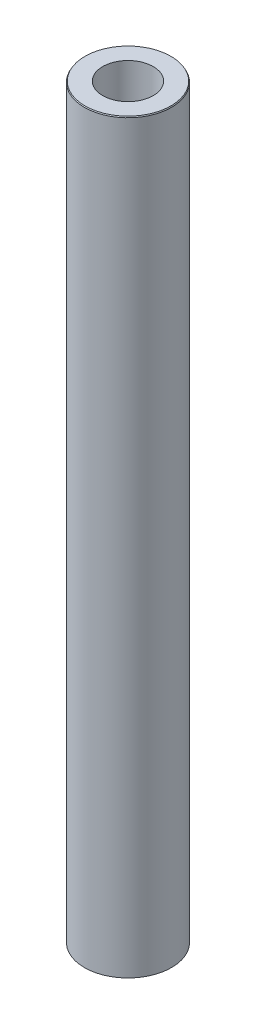
ISO-10303-21;
HEADER;
FILE_DESCRIPTION(('STEP AP214'),'2;1');
FILE_NAME('part.step','',(''),(''),'','','');
FILE_SCHEMA(('AUTOMOTIVE_DESIGN { 1 0 10303 214 1 1 1 1 }'));
ENDSEC;
DATA;
#1=APPLICATION_CONTEXT('core data for automotive mechanical design processes');
#2=APPLICATION_PROTOCOL_DEFINITION('international standard','automotive_design',2000,#1);
#3=PRODUCT_CONTEXT('',#1,'mechanical');
#4=PRODUCT('Part','Part','',(#3));
#5=PRODUCT_RELATED_PRODUCT_CATEGORY('part','',(#4));
#6=PRODUCT_DEFINITION_FORMATION('','',#4);
#7=PRODUCT_DEFINITION_CONTEXT('part definition',#1,'design');
#8=PRODUCT_DEFINITION('design','',#6,#7);
#9=PRODUCT_DEFINITION_SHAPE('','',#8);
#10=(LENGTH_UNIT() NAMED_UNIT(*) SI_UNIT(.MILLI.,.METRE.));
#11=(NAMED_UNIT(*) PLANE_ANGLE_UNIT() SI_UNIT($,.RADIAN.));
#12=(NAMED_UNIT(*) SI_UNIT($,.STERADIAN.) SOLID_ANGLE_UNIT());
#13=UNCERTAINTY_MEASURE_WITH_UNIT(LENGTH_MEASURE(1.E-05),#10,'distance_accuracy_value','');
#14=(GEOMETRIC_REPRESENTATION_CONTEXT(3) GLOBAL_UNCERTAINTY_ASSIGNED_CONTEXT((#13)) GLOBAL_UNIT_ASSIGNED_CONTEXT((#10,
#11,#12)) REPRESENTATION_CONTEXT('',''));
#15=CARTESIAN_POINT('',(0.,0.,0.));
#16=DIRECTION('',(0.,0.,1.));
#17=DIRECTION('',(1.,0.,0.));
#18=AXIS2_PLACEMENT_3D('',#15,#16,#17);
#19=CARTESIAN_POINT('',(0.,600.,0.));
#20=DIRECTION('',(0.,-1.,0.));
#21=DIRECTION('',(0.,0.,-1.));
#22=AXIS2_PLACEMENT_3D('',#19,#20,#21);
#23=CYLINDRICAL_SURFACE('',#22,35.);
#24=CARTESIAN_POINT('',(0.,599.197215256674,0.));
#25=DIRECTION('',(0.,1.,0.));
#26=DIRECTION('',(0.,0.,1.));
#27=AXIS2_PLACEMENT_3D('',#24,#25,#26);
#28=CIRCLE('',#27,35.);
#29=CARTESIAN_POINT('',(0.,599.197215256674,35.));
#30=VERTEX_POINT('',#29);
#31=EDGE_CURVE('E50',#30,#30,#28,.F.);
#32=ORIENTED_EDGE('',*,*,#31,.T.);
#33=EDGE_LOOP('',(#32));
#34=FACE_BOUND('',#33,.T.);
#35=CARTESIAN_POINT('',(0.,0.463487987660272,0.));
#36=DIRECTION('',(0.,1.,0.));
#37=DIRECTION('',(0.,0.,1.));
#38=AXIS2_PLACEMENT_3D('',#35,#36,#37);
#39=CIRCLE('',#38,35.);
#40=CARTESIAN_POINT('',(0.,0.463487987660272,35.));
#41=VERTEX_POINT('',#40);
#42=EDGE_CURVE('E51',#41,#41,#39,.T.);
#43=ORIENTED_EDGE('',*,*,#42,.T.);
#44=EDGE_LOOP('',(#43));
#45=FACE_BOUND('',#44,.T.);
#46=ADVANCED_FACE('F39',(#34,#45),#23,.T.);
#47=CARTESIAN_POINT('',(0.,600.,0.));
#48=DIRECTION('',(0.,1.,0.));
#49=DIRECTION('',(0.,0.,1.));
#50=AXIS2_PLACEMENT_3D('',#47,#48,#49);
#51=PLANE('',#50);
#52=CARTESIAN_POINT('',(0.,600.,0.));
#53=DIRECTION('',(0.,1.,0.));
#54=DIRECTION('',(0.,0.,1.));
#55=AXIS2_PLACEMENT_3D('',#52,#53,#54);
#56=CIRCLE('',#55,34.5365120123395);
#57=CARTESIAN_POINT('',(0.,600.,34.5365120123395));
#58=VERTEX_POINT('',#57);
#59=EDGE_CURVE('E54',#58,#58,#56,.T.);
#60=ORIENTED_EDGE('',*,*,#59,.T.);
#61=EDGE_LOOP('',(#60));
#62=FACE_BOUND('',#61,.T.);
#63=CARTESIAN_POINT('',(0.,600.,0.));
#64=DIRECTION('',(0.,1.,0.));
#65=DIRECTION('',(0.,0.,1.));
#66=AXIS2_PLACEMENT_3D('',#63,#64,#65);
#67=CIRCLE('',#66,20.2748592685679);
#68=CARTESIAN_POINT('',(0.,600.,20.2748592685679));
#69=VERTEX_POINT('',#68);
#70=EDGE_CURVE('E58',#69,#69,#67,.T.);
#71=ORIENTED_EDGE('',*,*,#70,.F.);
#72=EDGE_LOOP('',(#71));
#73=FACE_BOUND('',#72,.T.);
#74=ADVANCED_FACE('F69',(#62,#73),#51,.T.);
#75=CARTESIAN_POINT('',(0.,0.,0.));
#76=DIRECTION('',(0.,1.,0.));
#77=DIRECTION('',(0.,0.,1.));
#78=AXIS2_PLACEMENT_3D('',#75,#76,#77);
#79=PLANE('',#78);
#80=CARTESIAN_POINT('',(0.,0.,0.));
#81=DIRECTION('',(0.,1.,0.));
#82=DIRECTION('',(0.,0.,1.));
#83=AXIS2_PLACEMENT_3D('',#80,#81,#82);
#84=CIRCLE('',#83,34.1972152566745);
#85=CARTESIAN_POINT('',(0.,0.,34.1972152566745));
#86=VERTEX_POINT('',#85);
#87=EDGE_CURVE('E10',#86,#86,#84,.F.);
#88=ORIENTED_EDGE('',*,*,#87,.T.);
#89=EDGE_LOOP('',(#88));
#90=FACE_BOUND('',#89,.T.);
#91=CARTESIAN_POINT('',(0.,0.,0.));
#92=DIRECTION('',(0.,1.,0.));
#93=DIRECTION('',(0.,0.,1.));
#94=AXIS2_PLACEMENT_3D('',#91,#92,#93);
#95=CIRCLE('',#94,20.2748592685679);
#96=CARTESIAN_POINT('',(0.,0.,20.2748592685679));
#97=VERTEX_POINT('',#96);
#98=EDGE_CURVE('E63',#97,#97,#95,.T.);
#99=ORIENTED_EDGE('',*,*,#98,.T.);
#100=EDGE_LOOP('',(#99));
#101=FACE_BOUND('',#100,.T.);
#102=ADVANCED_FACE('F75',(#90,#101),#79,.F.);
#103=CARTESIAN_POINT('',(0.,600.,0.));
#104=DIRECTION('',(0.,-1.,0.));
#105=DIRECTION('',(0.,0.,-1.));
#106=AXIS2_PLACEMENT_3D('',#103,#104,#105);
#107=CYLINDRICAL_SURFACE('',#106,20.2748592685679);
#108=ORIENTED_EDGE('',*,*,#70,.T.);
#109=EDGE_LOOP('',(#108));
#110=FACE_BOUND('',#109,.T.);
#111=ORIENTED_EDGE('',*,*,#98,.F.);
#112=EDGE_LOOP('',(#111));
#113=FACE_BOUND('',#112,.T.);
#114=ADVANCED_FACE('F70',(#110,#113),#107,.F.);
#115=CARTESIAN_POINT('',(0.,600.,0.));
#116=DIRECTION('',(0.,-1.,0.));
#117=DIRECTION('',(0.,0.,-1.));
#118=AXIS2_PLACEMENT_3D('',#115,#116,#117);
#119=CONICAL_SURFACE('',#118,34.5365120123395,0.523598775598272);
#120=ORIENTED_EDGE('',*,*,#31,.F.);
#121=EDGE_LOOP('',(#120));
#122=FACE_BOUND('',#121,.T.);
#123=ORIENTED_EDGE('',*,*,#59,.F.);
#124=EDGE_LOOP('',(#123));
#125=FACE_BOUND('',#124,.T.);
#126=ADVANCED_FACE('F81',(#122,#125),#119,.T.);
#127=CARTESIAN_POINT('',(0.,0.463487987660272,0.));
#128=DIRECTION('',(0.,1.,0.));
#129=DIRECTION('',(0.,0.,1.));
#130=AXIS2_PLACEMENT_3D('',#127,#128,#129);
#131=CONICAL_SURFACE('',#130,35.,1.04719755119665);
#132=ORIENTED_EDGE('',*,*,#87,.F.);
#133=EDGE_LOOP('',(#132));
#134=FACE_BOUND('',#133,.T.);
#135=ORIENTED_EDGE('',*,*,#42,.F.);
#136=EDGE_LOOP('',(#135));
#137=FACE_BOUND('',#136,.T.);
#138=ADVANCED_FACE('F45',(#134,#137),#131,.T.);
#139=CLOSED_SHELL('',(#46,#74,#102,#114,#126,#138));
#140=MANIFOLD_SOLID_BREP('B2',#139);
#141=ADVANCED_BREP_SHAPE_REPRESENTATION('',(#18,#140),#14);
#142=SHAPE_DEFINITION_REPRESENTATION(#9,#141);
ENDSEC;
END-ISO-10303-21;
